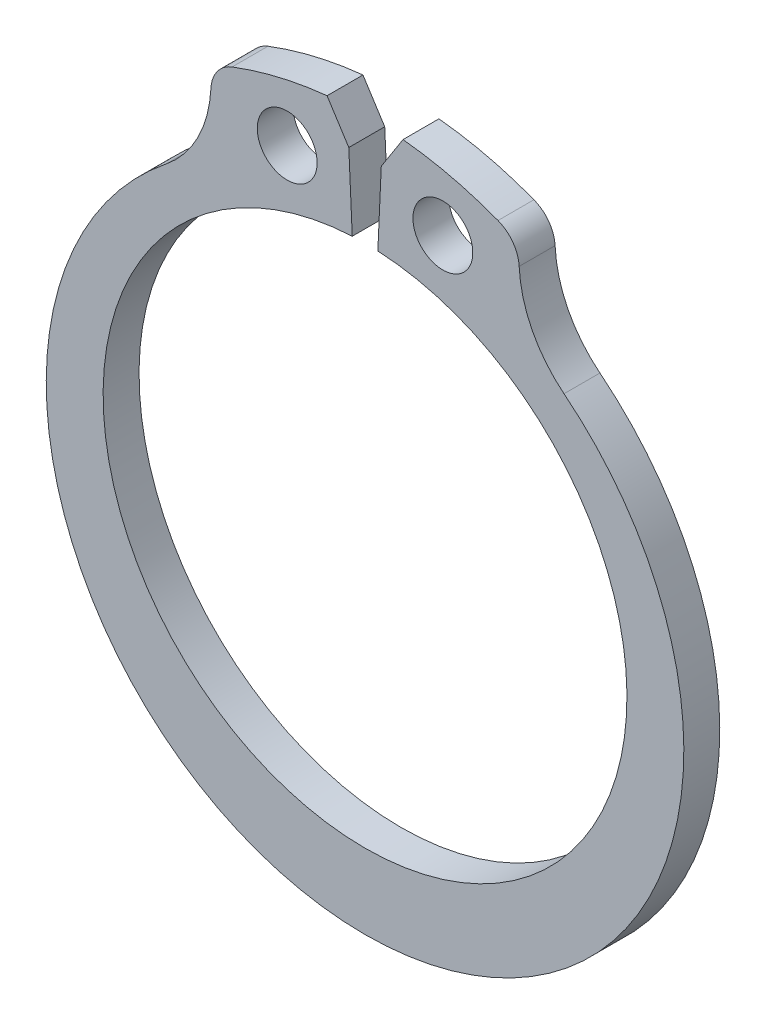
ISO-10303-21;
HEADER;
FILE_DESCRIPTION(('STEP AP214'),'2;1');
FILE_NAME('part.step','',(''),(''),'','','');
FILE_SCHEMA(('AUTOMOTIVE_DESIGN { 1 0 10303 214 1 1 1 1 }'));
ENDSEC;
DATA;
#1=APPLICATION_CONTEXT('core data for automotive mechanical design processes');
#2=APPLICATION_PROTOCOL_DEFINITION('international standard','automotive_design',2000,#1);
#3=PRODUCT_CONTEXT('',#1,'mechanical');
#4=PRODUCT('Part','Part','',(#3));
#5=PRODUCT_RELATED_PRODUCT_CATEGORY('part','',(#4));
#6=PRODUCT_DEFINITION_FORMATION('','',#4);
#7=PRODUCT_DEFINITION_CONTEXT('part definition',#1,'design');
#8=PRODUCT_DEFINITION('design','',#6,#7);
#9=PRODUCT_DEFINITION_SHAPE('','',#8);
#10=(LENGTH_UNIT() NAMED_UNIT(*) SI_UNIT(.MILLI.,.METRE.));
#11=(NAMED_UNIT(*) PLANE_ANGLE_UNIT() SI_UNIT($,.RADIAN.));
#12=(NAMED_UNIT(*) SI_UNIT($,.STERADIAN.) SOLID_ANGLE_UNIT());
#13=UNCERTAINTY_MEASURE_WITH_UNIT(LENGTH_MEASURE(1.E-05),#10,'distance_accuracy_value','');
#14=(GEOMETRIC_REPRESENTATION_CONTEXT(3) GLOBAL_UNCERTAINTY_ASSIGNED_CONTEXT((#13)) GLOBAL_UNIT_ASSIGNED_CONTEXT((#10,
#11,#12)) REPRESENTATION_CONTEXT('',''));
#15=CARTESIAN_POINT('',(0.,0.,0.));
#16=DIRECTION('',(0.,0.,1.));
#17=DIRECTION('',(1.,0.,0.));
#18=AXIS2_PLACEMENT_3D('',#15,#16,#17);
#19=CARTESIAN_POINT('',(0.,-0.168842637945176,0.6));
#20=DIRECTION('',(0.,0.,-1.));
#21=DIRECTION('',(1.,0.,0.));
#22=AXIS2_PLACEMENT_3D('',#19,#20,#21);
#23=CYLINDRICAL_SURFACE('',#22,4.375);
#24=DIRECTION('',(0.,0.,1.));
#25=VECTOR('',#24,1.);
#26=CARTESIAN_POINT('',(0.213698965557603,4.20093513124625,0.6));
#27=LINE('',#26,#25);
#28=CARTESIAN_POINT('',(0.213698965557603,4.20093513124625,0.3));
#29=VERTEX_POINT('',#28);
#30=CARTESIAN_POINT('',(0.213698965557603,4.20093513124625,0.9));
#31=VERTEX_POINT('',#30);
#32=EDGE_CURVE('E56',#29,#31,#27,.T.);
#33=ORIENTED_EDGE('',*,*,#32,.F.);
#34=CARTESIAN_POINT('',(0.,-0.168842637945176,0.3));
#35=DIRECTION('',(0.,0.,1.));
#36=DIRECTION('',(1.,0.,0.));
#37=AXIS2_PLACEMENT_3D('',#34,#35,#36);
#38=CIRCLE('',#37,4.375);
#39=CARTESIAN_POINT('',(-0.213698965557604,4.20093513124625,0.3));
#40=VERTEX_POINT('',#39);
#41=EDGE_CURVE('E238',#40,#29,#38,.T.);
#42=ORIENTED_EDGE('',*,*,#41,.F.);
#43=DIRECTION('',(0.,0.,-1.));
#44=VECTOR('',#43,1.);
#45=CARTESIAN_POINT('',(-0.213698965557604,4.20093513124625,0.6));
#46=LINE('',#45,#44);
#47=CARTESIAN_POINT('',(-0.213698965557605,4.20093513124625,0.9));
#48=VERTEX_POINT('',#47);
#49=EDGE_CURVE('E11',#48,#40,#46,.T.);
#50=ORIENTED_EDGE('',*,*,#49,.F.);
#51=CARTESIAN_POINT('',(0.,-0.168842637945176,0.9));
#52=DIRECTION('',(0.,0.,-1.));
#53=DIRECTION('',(1.,0.,0.));
#54=AXIS2_PLACEMENT_3D('',#51,#52,#53);
#55=CIRCLE('',#54,4.375);
#56=EDGE_CURVE('E194',#31,#48,#55,.T.);
#57=ORIENTED_EDGE('',*,*,#56,.F.);
#58=EDGE_LOOP('',(#33,#42,#50,#57));
#59=FACE_BOUND('',#58,.T.);
#60=ADVANCED_FACE('F37',(#59),#23,.F.);
#61=CARTESIAN_POINT('',(-0.142434621768567,2.64365736205482,0.9));
#62=DIRECTION('',(0.998954555563782,0.0457142857142855,0.));
#63=DIRECTION('',(0.0457142857142855,-0.998954555563782,0.));
#64=AXIS2_PLACEMENT_3D('',#61,#62,#63);
#65=PLANE('',#64);
#66=ORIENTED_EDGE('',*,*,#49,.T.);
#67=DIRECTION('',(-0.0457142857142855,0.998954555563782,0.));
#68=VECTOR('',#67,1.);
#69=CARTESIAN_POINT('',(0.,-0.468842637945176,0.3));
#70=LINE('',#69,#68);
#71=CARTESIAN_POINT('',(-0.27114060529438,5.45615736205482,0.3));
#72=VERTEX_POINT('',#71);
#73=EDGE_CURVE('E47',#40,#72,#70,.T.);
#74=ORIENTED_EDGE('',*,*,#73,.T.);
#75=DIRECTION('',(0.,0.,-1.));
#76=VECTOR('',#75,1.);
#77=CARTESIAN_POINT('',(-0.27114060529438,5.45615736205482,0.9));
#78=LINE('',#77,#76);
#79=CARTESIAN_POINT('',(-0.27114060529438,5.45615736205482,0.9));
#80=VERTEX_POINT('',#79);
#81=EDGE_CURVE('E204',#80,#72,#78,.T.);
#82=ORIENTED_EDGE('',*,*,#81,.F.);
#83=DIRECTION('',(-0.0457142857142855,0.998954555563782,0.));
#84=VECTOR('',#83,1.);
#85=CARTESIAN_POINT('',(0.,-0.468842637945176,0.9));
#86=LINE('',#85,#84);
#87=EDGE_CURVE('E211',#48,#80,#86,.T.);
#88=ORIENTED_EDGE('',*,*,#87,.F.);
#89=EDGE_LOOP('',(#66,#74,#82,#88));
#90=FACE_BOUND('',#89,.T.);
#91=ADVANCED_FACE('F270',(#90),#65,.T.);
#92=CARTESIAN_POINT('',(1.98097447992941,-0.0134354482449198,0.3));
#93=DIRECTION('',(0.,0.,1.));
#94=DIRECTION('',(1.,0.,0.));
#95=AXIS2_PLACEMENT_3D('',#92,#93,#94);
#96=PLANE('',#95);
#97=ORIENTED_EDGE('',*,*,#41,.T.);
#98=DIRECTION('',(0.0457142857142855,0.998954555563782,0.));
#99=VECTOR('',#98,1.);
#100=CARTESIAN_POINT('',(0.,-0.468842637945176,0.3));
#101=LINE('',#100,#99);
#102=CARTESIAN_POINT('',(0.271140605294378,5.45615736205482,0.3));
#103=VERTEX_POINT('',#102);
#104=EDGE_CURVE('E210',#29,#103,#101,.T.);
#105=ORIENTED_EDGE('',*,*,#104,.T.);
#106=DIRECTION('',(0.539067010526322,0.842262879487286,0.));
#107=VECTOR('',#106,1.);
#108=CARTESIAN_POINT('',(0.271140605294378,5.45615736205482,0.3));
#109=LINE('',#108,#107);
#110=CARTESIAN_POINT('',(0.634409735309024,6.02374561639122,0.3));
#111=VERTEX_POINT('',#110);
#112=EDGE_CURVE('E181',#103,#111,#109,.T.);
#113=ORIENTED_EDGE('',*,*,#112,.T.);
#114=CARTESIAN_POINT('',(0.,-0.168842637945176,0.3));
#115=DIRECTION('',(0.,0.,1.));
#116=DIRECTION('',(1.,0.,0.));
#117=AXIS2_PLACEMENT_3D('',#114,#115,#116);
#118=CIRCLE('',#117,6.225);
#119=CARTESIAN_POINT('',(2.2210684741218,5.64643722060524,0.3));
#120=VERTEX_POINT('',#119);
#121=EDGE_CURVE('E169',#120,#111,#118,.T.);
#122=ORIENTED_EDGE('',*,*,#121,.F.);
#123=CARTESIAN_POINT('',(2.02482949247248,5.13263739374537,0.3));
#124=DIRECTION('',(0.,0.,1.));
#125=DIRECTION('',(1.,0.,0.));
#126=AXIS2_PLACEMENT_3D('',#123,#124,#125);
#127=CIRCLE('',#126,0.55);
#128=CARTESIAN_POINT('',(2.57420430652566,5.15885406180281,0.3));
#129=VERTEX_POINT('',#128);
#130=EDGE_CURVE('E41',#129,#120,#127,.T.);
#131=ORIENTED_EDGE('',*,*,#130,.F.);
#132=CARTESIAN_POINT('',(4.57193090308268,5.25418740019349,0.3));
#133=DIRECTION('',(0.,0.,1.));
#134=DIRECTION('',(1.,0.,0.));
#135=AXIS2_PLACEMENT_3D('',#132,#133,#134);
#136=CIRCLE('',#135,2.);
#137=CARTESIAN_POINT('',(3.323622124084,3.69158534199864,0.3));
#138=VERTEX_POINT('',#137);
#139=EDGE_CURVE('E179',#129,#138,#136,.T.);
#140=ORIENTED_EDGE('',*,*,#139,.T.);
#141=CARTESIAN_POINT('',(0.,-0.468842637945176,0.3));
#142=DIRECTION('',(0.,0.,1.));
#143=DIRECTION('',(1.,0.,0.));
#144=AXIS2_PLACEMENT_3D('',#141,#142,#143);
#145=CIRCLE('',#144,5.325);
#146=CARTESIAN_POINT('',(-3.323622124084,3.69158534199864,0.299999999999999));
#147=VERTEX_POINT('',#146);
#148=EDGE_CURVE('E188',#147,#138,#145,.T.);
#149=ORIENTED_EDGE('',*,*,#148,.F.);
#150=CARTESIAN_POINT('',(-4.57193090308269,5.25418740019349,0.299999999999999));
#151=DIRECTION('',(0.,0.,-1.));
#152=DIRECTION('',(-1.,0.,0.));
#153=AXIS2_PLACEMENT_3D('',#150,#151,#152);
#154=CIRCLE('',#153,2.);
#155=CARTESIAN_POINT('',(-2.57420430652567,5.15885406180281,0.299999999999999));
#156=VERTEX_POINT('',#155);
#157=EDGE_CURVE('E134',#156,#147,#154,.T.);
#158=ORIENTED_EDGE('',*,*,#157,.F.);
#159=CARTESIAN_POINT('',(-2.02482949247249,5.13263739374537,0.3));
#160=DIRECTION('',(0.,0.,1.));
#161=DIRECTION('',(-1.,0.,0.));
#162=AXIS2_PLACEMENT_3D('',#159,#160,#161);
#163=CIRCLE('',#162,0.55);
#164=CARTESIAN_POINT('',(-2.2210684741218,5.64643722060524,0.3));
#165=VERTEX_POINT('',#164);
#166=EDGE_CURVE('E137',#165,#156,#163,.T.);
#167=ORIENTED_EDGE('',*,*,#166,.F.);
#168=CARTESIAN_POINT('',(0.,-0.168842637945176,0.3));
#169=DIRECTION('',(0.,0.,1.));
#170=DIRECTION('',(-1.,0.,0.));
#171=AXIS2_PLACEMENT_3D('',#168,#169,#170);
#172=CIRCLE('',#171,6.225);
#173=CARTESIAN_POINT('',(-0.634409735309026,6.02374561639122,0.3));
#174=VERTEX_POINT('',#173);
#175=EDGE_CURVE('E206',#174,#165,#172,.T.);
#176=ORIENTED_EDGE('',*,*,#175,.F.);
#177=DIRECTION('',(-0.539067010526322,0.842262879487286,0.));
#178=VECTOR('',#177,1.);
#179=CARTESIAN_POINT('',(-0.27114060529438,5.45615736205482,0.3));
#180=LINE('',#179,#178);
#181=EDGE_CURVE('E192',#72,#174,#180,.T.);
#182=ORIENTED_EDGE('',*,*,#181,.F.);
#183=ORIENTED_EDGE('',*,*,#73,.F.);
#184=EDGE_LOOP('',(#97,#105,#113,#122,#131,#140,#149,#158,#167,#176,#182,#183));
#185=FACE_BOUND('',#184,.T.);
#186=CARTESIAN_POINT('',(1.3,4.96925039352087,0.3));
#187=DIRECTION('',(0.,0.,1.));
#188=DIRECTION('',(1.,0.,0.));
#189=AXIS2_PLACEMENT_3D('',#186,#187,#188);
#190=CIRCLE('',#189,0.5);
#191=CARTESIAN_POINT('',(0.799999999999999,4.96925039352087,0.3));
#192=VERTEX_POINT('',#191);
#193=EDGE_CURVE('E182',#192,#192,#190,.T.);
#194=ORIENTED_EDGE('',*,*,#193,.T.);
#195=EDGE_LOOP('',(#194));
#196=FACE_BOUND('',#195,.T.);
#197=CARTESIAN_POINT('',(-1.3,4.96925039352087,0.3));
#198=DIRECTION('',(0.,0.,1.));
#199=DIRECTION('',(-1.,0.,0.));
#200=AXIS2_PLACEMENT_3D('',#197,#198,#199);
#201=CIRCLE('',#200,0.5);
#202=CARTESIAN_POINT('',(-0.800000000000001,4.96925039352087,0.3));
#203=VERTEX_POINT('',#202);
#204=EDGE_CURVE('E189',#203,#203,#201,.T.);
#205=ORIENTED_EDGE('',*,*,#204,.T.);
#206=EDGE_LOOP('',(#205));
#207=FACE_BOUND('',#206,.T.);
#208=ADVANCED_FACE('F258',(#185,#196,#207),#96,.F.);
#209=CARTESIAN_POINT('',(-1.3,4.96925039352087,0.6));
#210=DIRECTION('',(0.,0.,1.));
#211=DIRECTION('',(-1.,0.,0.));
#212=AXIS2_PLACEMENT_3D('',#209,#210,#211);
#213=CYLINDRICAL_SURFACE('',#212,0.5);
#214=CARTESIAN_POINT('',(-1.3,4.96925039352087,0.9));
#215=DIRECTION('',(0.,0.,-1.));
#216=DIRECTION('',(-1.,0.,0.));
#217=AXIS2_PLACEMENT_3D('',#214,#215,#216);
#218=CIRCLE('',#217,0.5);
#219=CARTESIAN_POINT('',(-0.800000000000001,4.96925039352087,0.9));
#220=VERTEX_POINT('',#219);
#221=EDGE_CURVE('E240',#220,#220,#218,.T.);
#222=ORIENTED_EDGE('',*,*,#221,.F.);
#223=EDGE_LOOP('',(#222));
#224=FACE_BOUND('',#223,.T.);
#225=ORIENTED_EDGE('',*,*,#204,.F.);
#226=EDGE_LOOP('',(#225));
#227=FACE_BOUND('',#226,.T.);
#228=ADVANCED_FACE('F369',(#224,#227),#213,.F.);
#229=CARTESIAN_POINT('',(-0.452775170301704,5.73995148922302,0.9));
#230=DIRECTION('',(0.842262879487286,0.539067010526322,0.));
#231=DIRECTION('',(0.539067010526322,-0.842262879487286,0.));
#232=AXIS2_PLACEMENT_3D('',#229,#230,#231);
#233=PLANE('',#232);
#234=ORIENTED_EDGE('',*,*,#181,.T.);
#235=DIRECTION('',(0.,0.,-1.));
#236=VECTOR('',#235,1.);
#237=CARTESIAN_POINT('',(-0.634409735309026,6.02374561639122,0.9));
#238=LINE('',#237,#236);
#239=CARTESIAN_POINT('',(-0.634409735309026,6.02374561639122,0.9));
#240=VERTEX_POINT('',#239);
#241=EDGE_CURVE('E233',#240,#174,#238,.T.);
#242=ORIENTED_EDGE('',*,*,#241,.F.);
#243=DIRECTION('',(-0.539067010526322,0.842262879487286,0.));
#244=VECTOR('',#243,1.);
#245=CARTESIAN_POINT('',(-0.27114060529438,5.45615736205482,0.9));
#246=LINE('',#245,#244);
#247=EDGE_CURVE('E92',#80,#240,#246,.T.);
#248=ORIENTED_EDGE('',*,*,#247,.F.);
#249=ORIENTED_EDGE('',*,*,#81,.T.);
#250=EDGE_LOOP('',(#234,#242,#248,#249));
#251=FACE_BOUND('',#250,.T.);
#252=ADVANCED_FACE('F371',(#251),#233,.T.);
#253=CARTESIAN_POINT('',(0.,-0.168842637945176,0.9));
#254=DIRECTION('',(0.,0.,1.));
#255=DIRECTION('',(-1.,0.,0.));
#256=AXIS2_PLACEMENT_3D('',#253,#254,#255);
#257=CYLINDRICAL_SURFACE('',#256,6.225);
#258=ORIENTED_EDGE('',*,*,#175,.T.);
#259=DIRECTION('',(0.,0.,-1.));
#260=VECTOR('',#259,1.);
#261=CARTESIAN_POINT('',(-2.2210684741218,5.64643722060524,0.9));
#262=LINE('',#261,#260);
#263=CARTESIAN_POINT('',(-2.2210684741218,5.64643722060524,0.9));
#264=VERTEX_POINT('',#263);
#265=EDGE_CURVE('E100',#264,#165,#262,.T.);
#266=ORIENTED_EDGE('',*,*,#265,.F.);
#267=CARTESIAN_POINT('',(0.,-0.168842637945176,0.9));
#268=DIRECTION('',(0.,0.,-1.));
#269=DIRECTION('',(-1.,0.,0.));
#270=AXIS2_PLACEMENT_3D('',#267,#268,#269);
#271=CIRCLE('',#270,6.225);
#272=EDGE_CURVE('E201',#264,#240,#271,.T.);
#273=ORIENTED_EDGE('',*,*,#272,.T.);
#274=ORIENTED_EDGE('',*,*,#241,.T.);
#275=EDGE_LOOP('',(#258,#266,#273,#274));
#276=FACE_BOUND('',#275,.T.);
#277=ADVANCED_FACE('F39',(#276),#257,.T.);
#278=CARTESIAN_POINT('',(-2.02482949247249,5.13263739374537,0.9));
#279=DIRECTION('',(0.,0.,1.));
#280=DIRECTION('',(-1.,0.,0.));
#281=AXIS2_PLACEMENT_3D('',#278,#279,#280);
#282=CYLINDRICAL_SURFACE('',#281,0.55);
#283=ORIENTED_EDGE('',*,*,#166,.T.);
#284=DIRECTION('',(0.,0.,-1.));
#285=VECTOR('',#284,1.);
#286=CARTESIAN_POINT('',(-2.57420430652567,5.15885406180281,0.9));
#287=LINE('',#286,#285);
#288=CARTESIAN_POINT('',(-2.57420430652567,5.15885406180281,0.9));
#289=VERTEX_POINT('',#288);
#290=EDGE_CURVE('E212',#289,#156,#287,.T.);
#291=ORIENTED_EDGE('',*,*,#290,.F.);
#292=CARTESIAN_POINT('',(-2.02482949247249,5.13263739374537,0.9));
#293=DIRECTION('',(0.,0.,-1.));
#294=DIRECTION('',(-1.,0.,0.));
#295=AXIS2_PLACEMENT_3D('',#292,#293,#294);
#296=CIRCLE('',#295,0.55);
#297=EDGE_CURVE('E216',#289,#264,#296,.T.);
#298=ORIENTED_EDGE('',*,*,#297,.T.);
#299=ORIENTED_EDGE('',*,*,#265,.T.);
#300=EDGE_LOOP('',(#283,#291,#298,#299));
#301=FACE_BOUND('',#300,.T.);
#302=ADVANCED_FACE('F278',(#301),#282,.T.);
#303=CARTESIAN_POINT('',(-4.57193090308269,5.25418740019349,0.9));
#304=DIRECTION('',(0.,0.,1.));
#305=DIRECTION('',(-1.,0.,0.));
#306=AXIS2_PLACEMENT_3D('',#303,#304,#305);
#307=CYLINDRICAL_SURFACE('',#306,2.);
#308=ORIENTED_EDGE('',*,*,#157,.T.);
#309=DIRECTION('',(0.,0.,-1.));
#310=VECTOR('',#309,1.);
#311=CARTESIAN_POINT('',(-3.323622124084,3.69158534199864,0.9));
#312=LINE('',#311,#310);
#313=CARTESIAN_POINT('',(-3.323622124084,3.69158534199864,0.9));
#314=VERTEX_POINT('',#313);
#315=EDGE_CURVE('E184',#314,#147,#312,.T.);
#316=ORIENTED_EDGE('',*,*,#315,.F.);
#317=CARTESIAN_POINT('',(-4.57193090308269,5.25418740019349,0.9));
#318=DIRECTION('',(0.,0.,-1.));
#319=DIRECTION('',(-1.,0.,0.));
#320=AXIS2_PLACEMENT_3D('',#317,#318,#319);
#321=CIRCLE('',#320,2.);
#322=EDGE_CURVE('E242',#289,#314,#321,.T.);
#323=ORIENTED_EDGE('',*,*,#322,.F.);
#324=ORIENTED_EDGE('',*,*,#290,.T.);
#325=EDGE_LOOP('',(#308,#316,#323,#324));
#326=FACE_BOUND('',#325,.T.);
#327=ADVANCED_FACE('F255',(#326),#307,.F.);
#328=CARTESIAN_POINT('',(1.3,4.96925039352087,0.6));
#329=DIRECTION('',(0.,0.,-1.));
#330=DIRECTION('',(1.,0.,0.));
#331=AXIS2_PLACEMENT_3D('',#328,#329,#330);
#332=CYLINDRICAL_SURFACE('',#331,0.5);
#333=ORIENTED_EDGE('',*,*,#193,.F.);
#334=EDGE_LOOP('',(#333));
#335=FACE_BOUND('',#334,.T.);
#336=CARTESIAN_POINT('',(1.3,4.96925039352087,0.9));
#337=DIRECTION('',(0.,0.,-1.));
#338=DIRECTION('',(1.,0.,0.));
#339=AXIS2_PLACEMENT_3D('',#336,#337,#338);
#340=CIRCLE('',#339,0.5);
#341=CARTESIAN_POINT('',(0.799999999999999,4.96925039352087,0.9));
#342=VERTEX_POINT('',#341);
#343=EDGE_CURVE('E243',#342,#342,#340,.T.);
#344=ORIENTED_EDGE('',*,*,#343,.F.);
#345=EDGE_LOOP('',(#344));
#346=FACE_BOUND('',#345,.T.);
#347=ADVANCED_FACE('F282',(#335,#346),#332,.F.);
#348=CARTESIAN_POINT('',(0.142434621768566,2.64365736205482,0.3));
#349=DIRECTION('',(-0.998954555563782,0.0457142857142855,0.));
#350=DIRECTION('',(-0.0457142857142855,-0.998954555563782,0.));
#351=AXIS2_PLACEMENT_3D('',#348,#349,#350);
#352=PLANE('',#351);
#353=ORIENTED_EDGE('',*,*,#32,.T.);
#354=DIRECTION('',(0.0457142857142855,0.998954555563782,0.));
#355=VECTOR('',#354,1.);
#356=CARTESIAN_POINT('',(0.,-0.468842637945176,0.9));
#357=LINE('',#356,#355);
#358=CARTESIAN_POINT('',(0.271140605294378,5.45615736205482,0.9));
#359=VERTEX_POINT('',#358);
#360=EDGE_CURVE('E220',#31,#359,#357,.T.);
#361=ORIENTED_EDGE('',*,*,#360,.T.);
#362=DIRECTION('',(0.,0.,1.));
#363=VECTOR('',#362,1.);
#364=CARTESIAN_POINT('',(0.271140605294378,5.45615736205482,0.3));
#365=LINE('',#364,#363);
#366=EDGE_CURVE('E168',#103,#359,#365,.T.);
#367=ORIENTED_EDGE('',*,*,#366,.F.);
#368=ORIENTED_EDGE('',*,*,#104,.F.);
#369=EDGE_LOOP('',(#353,#361,#367,#368));
#370=FACE_BOUND('',#369,.T.);
#371=ADVANCED_FACE('F284',(#370),#352,.T.);
#372=CARTESIAN_POINT('',(0.452775170301702,5.73995148922302,0.3));
#373=DIRECTION('',(-0.842262879487286,0.539067010526322,0.));
#374=DIRECTION('',(-0.539067010526322,-0.842262879487286,0.));
#375=AXIS2_PLACEMENT_3D('',#372,#373,#374);
#376=PLANE('',#375);
#377=DIRECTION('',(0.539067010526322,0.842262879487286,0.));
#378=VECTOR('',#377,1.);
#379=CARTESIAN_POINT('',(0.271140605294378,5.45615736205482,0.9));
#380=LINE('',#379,#378);
#381=CARTESIAN_POINT('',(0.634409735309024,6.02374561639122,0.9));
#382=VERTEX_POINT('',#381);
#383=EDGE_CURVE('E231',#359,#382,#380,.T.);
#384=ORIENTED_EDGE('',*,*,#383,.T.);
#385=DIRECTION('',(0.,0.,1.));
#386=VECTOR('',#385,1.);
#387=CARTESIAN_POINT('',(0.634409735309024,6.02374561639122,0.3));
#388=LINE('',#387,#386);
#389=EDGE_CURVE('E165',#111,#382,#388,.T.);
#390=ORIENTED_EDGE('',*,*,#389,.F.);
#391=ORIENTED_EDGE('',*,*,#112,.F.);
#392=ORIENTED_EDGE('',*,*,#366,.T.);
#393=EDGE_LOOP('',(#384,#390,#391,#392));
#394=FACE_BOUND('',#393,.T.);
#395=ADVANCED_FACE('F289',(#394),#376,.T.);
#396=CARTESIAN_POINT('',(0.,-0.168842637945176,0.3));
#397=DIRECTION('',(0.,0.,-1.));
#398=DIRECTION('',(1.,0.,0.));
#399=AXIS2_PLACEMENT_3D('',#396,#397,#398);
#400=CYLINDRICAL_SURFACE('',#399,6.225);
#401=CARTESIAN_POINT('',(0.,-0.168842637945176,0.9));
#402=DIRECTION('',(0.,0.,-1.));
#403=DIRECTION('',(1.,0.,0.));
#404=AXIS2_PLACEMENT_3D('',#401,#402,#403);
#405=CIRCLE('',#404,6.225);
#406=CARTESIAN_POINT('',(2.2210684741218,5.64643722060524,0.9));
#407=VERTEX_POINT('',#406);
#408=EDGE_CURVE('E162',#382,#407,#405,.T.);
#409=ORIENTED_EDGE('',*,*,#408,.T.);
#410=DIRECTION('',(0.,0.,1.));
#411=VECTOR('',#410,1.);
#412=CARTESIAN_POINT('',(2.2210684741218,5.64643722060524,0.3));
#413=LINE('',#412,#411);
#414=EDGE_CURVE('E151',#120,#407,#413,.T.);
#415=ORIENTED_EDGE('',*,*,#414,.F.);
#416=ORIENTED_EDGE('',*,*,#121,.T.);
#417=ORIENTED_EDGE('',*,*,#389,.T.);
#418=EDGE_LOOP('',(#409,#415,#416,#417));
#419=FACE_BOUND('',#418,.T.);
#420=ADVANCED_FACE('F163',(#419),#400,.T.);
#421=CARTESIAN_POINT('',(2.02482949247248,5.13263739374537,0.3));
#422=DIRECTION('',(0.,0.,-1.));
#423=DIRECTION('',(1.,0.,0.));
#424=AXIS2_PLACEMENT_3D('',#421,#422,#423);
#425=CYLINDRICAL_SURFACE('',#424,0.55);
#426=CARTESIAN_POINT('',(2.02482949247248,5.13263739374537,0.9));
#427=DIRECTION('',(0.,0.,-1.));
#428=DIRECTION('',(1.,0.,0.));
#429=AXIS2_PLACEMENT_3D('',#426,#427,#428);
#430=CIRCLE('',#429,0.55);
#431=CARTESIAN_POINT('',(2.57420430652566,5.15885406180281,0.9));
#432=VERTEX_POINT('',#431);
#433=EDGE_CURVE('E155',#407,#432,#430,.T.);
#434=ORIENTED_EDGE('',*,*,#433,.T.);
#435=DIRECTION('',(0.,0.,1.));
#436=VECTOR('',#435,1.);
#437=CARTESIAN_POINT('',(2.57420430652566,5.15885406180281,0.3));
#438=LINE('',#437,#436);
#439=EDGE_CURVE('E145',#129,#432,#438,.T.);
#440=ORIENTED_EDGE('',*,*,#439,.F.);
#441=ORIENTED_EDGE('',*,*,#130,.T.);
#442=ORIENTED_EDGE('',*,*,#414,.T.);
#443=EDGE_LOOP('',(#434,#440,#441,#442));
#444=FACE_BOUND('',#443,.T.);
#445=ADVANCED_FACE('F153',(#444),#425,.T.);
#446=CARTESIAN_POINT('',(4.57193090308268,5.25418740019349,0.3));
#447=DIRECTION('',(0.,0.,-1.));
#448=DIRECTION('',(1.,0.,0.));
#449=AXIS2_PLACEMENT_3D('',#446,#447,#448);
#450=CYLINDRICAL_SURFACE('',#449,2.);
#451=CARTESIAN_POINT('',(4.57193090308268,5.25418740019349,0.9));
#452=DIRECTION('',(0.,0.,1.));
#453=DIRECTION('',(1.,0.,0.));
#454=AXIS2_PLACEMENT_3D('',#451,#452,#453);
#455=CIRCLE('',#454,2.);
#456=CARTESIAN_POINT('',(3.323622124084,3.69158534199864,0.9));
#457=VERTEX_POINT('',#456);
#458=EDGE_CURVE('E159',#432,#457,#455,.T.);
#459=ORIENTED_EDGE('',*,*,#458,.T.);
#460=DIRECTION('',(0.,0.,1.));
#461=VECTOR('',#460,1.);
#462=CARTESIAN_POINT('',(3.323622124084,3.69158534199864,0.3));
#463=LINE('',#462,#461);
#464=EDGE_CURVE('E193',#138,#457,#463,.T.);
#465=ORIENTED_EDGE('',*,*,#464,.F.);
#466=ORIENTED_EDGE('',*,*,#139,.F.);
#467=ORIENTED_EDGE('',*,*,#439,.T.);
#468=EDGE_LOOP('',(#459,#465,#466,#467));
#469=FACE_BOUND('',#468,.T.);
#470=ADVANCED_FACE('F260',(#469),#450,.F.);
#471=CARTESIAN_POINT('',(0.,-0.468842637945176,0.3));
#472=DIRECTION('',(0.,0.,-1.));
#473=DIRECTION('',(1.,0.,0.));
#474=AXIS2_PLACEMENT_3D('',#471,#472,#473);
#475=CYLINDRICAL_SURFACE('',#474,5.325);
#476=CARTESIAN_POINT('',(0.,-0.468842637945176,0.9));
#477=DIRECTION('',(0.,0.,-1.));
#478=DIRECTION('',(1.,0.,0.));
#479=AXIS2_PLACEMENT_3D('',#476,#477,#478);
#480=CIRCLE('',#479,5.325);
#481=EDGE_CURVE('E187',#457,#314,#480,.T.);
#482=ORIENTED_EDGE('',*,*,#481,.T.);
#483=ORIENTED_EDGE('',*,*,#315,.T.);
#484=ORIENTED_EDGE('',*,*,#148,.T.);
#485=ORIENTED_EDGE('',*,*,#464,.T.);
#486=EDGE_LOOP('',(#482,#483,#484,#485));
#487=FACE_BOUND('',#486,.T.);
#488=ADVANCED_FACE('F256',(#487),#475,.T.);
#489=CARTESIAN_POINT('',(1.98097447992941,-0.0134354482449198,0.9));
#490=DIRECTION('',(0.,0.,1.));
#491=DIRECTION('',(1.,0.,0.));
#492=AXIS2_PLACEMENT_3D('',#489,#490,#491);
#493=PLANE('',#492);
#494=ORIENTED_EDGE('',*,*,#56,.T.);
#495=ORIENTED_EDGE('',*,*,#87,.T.);
#496=ORIENTED_EDGE('',*,*,#247,.T.);
#497=ORIENTED_EDGE('',*,*,#272,.F.);
#498=ORIENTED_EDGE('',*,*,#297,.F.);
#499=ORIENTED_EDGE('',*,*,#322,.T.);
#500=ORIENTED_EDGE('',*,*,#481,.F.);
#501=ORIENTED_EDGE('',*,*,#458,.F.);
#502=ORIENTED_EDGE('',*,*,#433,.F.);
#503=ORIENTED_EDGE('',*,*,#408,.F.);
#504=ORIENTED_EDGE('',*,*,#383,.F.);
#505=ORIENTED_EDGE('',*,*,#360,.F.);
#506=EDGE_LOOP('',(#494,#495,#496,#497,#498,#499,#500,#501,#502,#503,#504,#505));
#507=FACE_BOUND('',#506,.T.);
#508=ORIENTED_EDGE('',*,*,#221,.T.);
#509=EDGE_LOOP('',(#508));
#510=FACE_BOUND('',#509,.T.);
#511=ORIENTED_EDGE('',*,*,#343,.T.);
#512=EDGE_LOOP('',(#511));
#513=FACE_BOUND('',#512,.T.);
#514=ADVANCED_FACE('F171',(#507,#510,#513),#493,.T.);
#515=CLOSED_SHELL('',(#60,#91,#208,#228,#252,#277,#302,#327,#347,#371,#395,#420,#445,#470,#488,#514));
#516=MANIFOLD_SOLID_BREP('B2',#515);
#517=ADVANCED_BREP_SHAPE_REPRESENTATION('',(#18,#516),#14);
#518=SHAPE_DEFINITION_REPRESENTATION(#9,#517);
ENDSEC;
END-ISO-10303-21;
